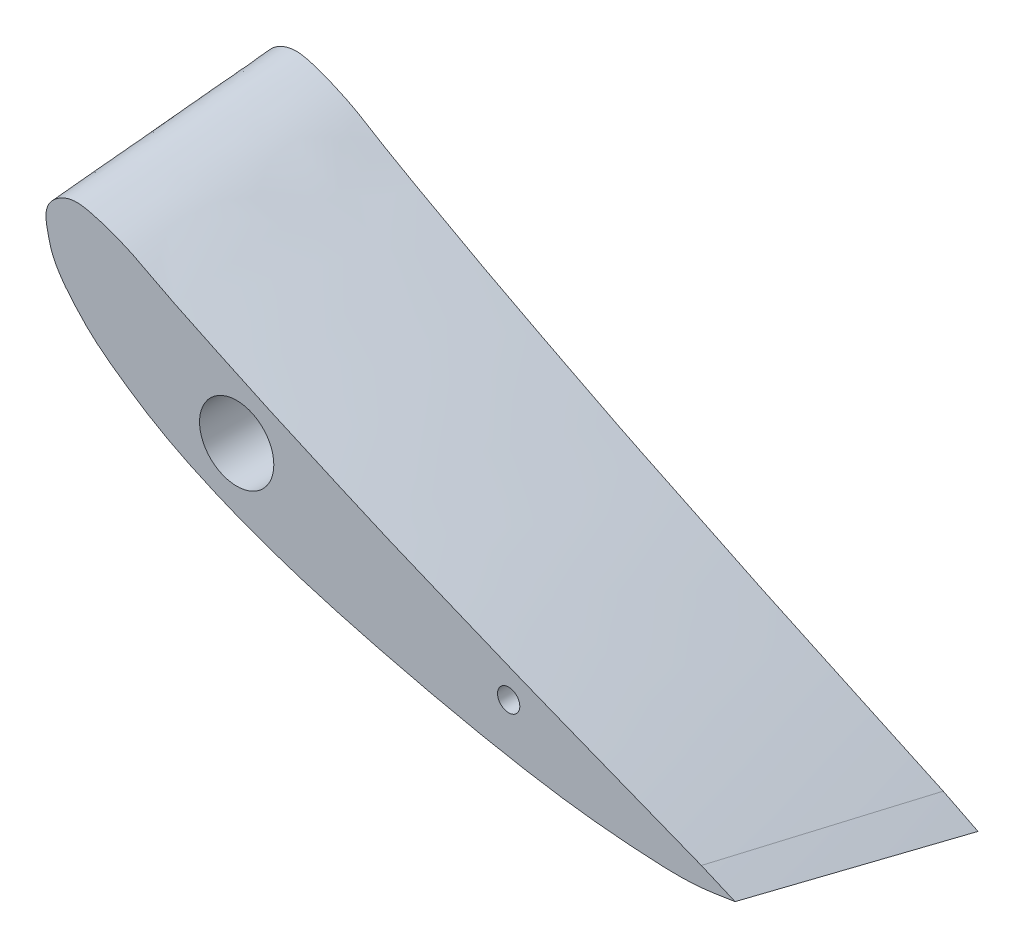
ISO-10303-21;
HEADER;
FILE_DESCRIPTION(('STEP AP214'),'2;1');
FILE_NAME('part.step','',(''),(''),'','','');
FILE_SCHEMA(('AUTOMOTIVE_DESIGN { 1 0 10303 214 1 1 1 1 }'));
ENDSEC;
DATA;
#1=APPLICATION_CONTEXT('core data for automotive mechanical design processes');
#2=APPLICATION_PROTOCOL_DEFINITION('international standard','automotive_design',2000,#1);
#3=PRODUCT_CONTEXT('',#1,'mechanical');
#4=PRODUCT('Part','Part','',(#3));
#5=PRODUCT_RELATED_PRODUCT_CATEGORY('part','',(#4));
#6=PRODUCT_DEFINITION_FORMATION('','',#4);
#7=PRODUCT_DEFINITION_CONTEXT('part definition',#1,'design');
#8=PRODUCT_DEFINITION('design','',#6,#7);
#9=PRODUCT_DEFINITION_SHAPE('','',#8);
#10=(LENGTH_UNIT() NAMED_UNIT(*) SI_UNIT(.MILLI.,.METRE.));
#11=(NAMED_UNIT(*) PLANE_ANGLE_UNIT() SI_UNIT($,.RADIAN.));
#12=(NAMED_UNIT(*) SI_UNIT($,.STERADIAN.) SOLID_ANGLE_UNIT());
#13=UNCERTAINTY_MEASURE_WITH_UNIT(LENGTH_MEASURE(1.E-05),#10,'distance_accuracy_value','');
#14=(GEOMETRIC_REPRESENTATION_CONTEXT(3) GLOBAL_UNCERTAINTY_ASSIGNED_CONTEXT((#13)) GLOBAL_UNIT_ASSIGNED_CONTEXT((#10,
#11,#12)) REPRESENTATION_CONTEXT('',''));
#15=CARTESIAN_POINT('',(0.,0.,0.));
#16=DIRECTION('',(0.,0.,1.));
#17=DIRECTION('',(1.,0.,0.));
#18=AXIS2_PLACEMENT_3D('',#15,#16,#17);
#19=CARTESIAN_POINT('',(-25.8751677995834,12.5690081194773,-30.));
#20=DIRECTION('',(0.,0.,1.));
#21=DIRECTION('',(1.,0.,0.));
#22=AXIS2_PLACEMENT_3D('',#19,#20,#21);
#23=PLANE('',#22);
#24=CARTESIAN_POINT('',(36.622171624693,-11.6170764544321,-30.));
#25=DIRECTION('',(0.,0.,1.));
#26=DIRECTION('',(1.,0.,0.));
#27=AXIS2_PLACEMENT_3D('',#24,#25,#26);
#28=CIRCLE('',#27,1.5);
#29=CARTESIAN_POINT('',(38.122171624693,-11.6170764544321,-30.));
#30=VERTEX_POINT('',#29);
#31=EDGE_CURVE('E86',#30,#30,#28,.T.);
#32=ORIENTED_EDGE('',*,*,#31,.T.);
#33=EDGE_LOOP('',(#32));
#34=FACE_BOUND('',#33,.T.);
#35=CARTESIAN_POINT('',(0.,0.,-30.));
#36=DIRECTION('',(0.,0.,1.));
#37=DIRECTION('',(1.,0.,0.));
#38=AXIS2_PLACEMENT_3D('',#35,#36,#37);
#39=CIRCLE('',#38,5.);
#40=CARTESIAN_POINT('',(5.,0.,-30.));
#41=VERTEX_POINT('',#40);
#42=EDGE_CURVE('E66',#41,#41,#39,.T.);
#43=ORIENTED_EDGE('',*,*,#42,.T.);
#44=EDGE_LOOP('',(#43));
#45=FACE_BOUND('',#44,.T.);
#46=CARTESIAN_POINT('',(65.134579844463,-22.9995309699649,-30.));
#47=CARTESIAN_POINT('',(63.5496914173049,-22.2622479812306,-30.));
#48=CARTESIAN_POINT('',(58.7950261358319,-20.0503990150295,-30.));
#49=CARTESIAN_POINT('',(50.8778175646714,-16.3487993381326,-30.));
#50=CARTESIAN_POINT('',(41.343512177954,-11.9802548823201,-30.));
#51=CARTESIAN_POINT('',(31.9375337278064,-7.34505211960584,-30.));
#52=CARTESIAN_POINT('',(22.4610505783409,-2.85785760789748,-30.));
#53=CARTESIAN_POINT('',(13.1446016186923,1.95170321629111,-30.));
#54=CARTESIAN_POINT('',(3.81950525001302,6.74877896799742,-30.));
#55=CARTESIAN_POINT('',(-3.8226140362771,10.9907198333955,-30.));
#56=CARTESIAN_POINT('',(-9.95617244202911,14.3624267984176,-30.));
#57=CARTESIAN_POINT('',(-13.6261568834983,16.7539862442742,-30.));
#58=CARTESIAN_POINT('',(-16.8002450756207,18.2635947971804,-30.));
#59=CARTESIAN_POINT('',(-19.2653703672842,19.2079849467583,-30.));
#60=CARTESIAN_POINT('',(-21.5497566138504,19.8875449709311,-30.));
#61=CARTESIAN_POINT('',(-24.1000289050709,19.4894676075075,-30.));
#62=CARTESIAN_POINT('',(-26.6314421320634,17.5564579994679,-30.));
#63=CARTESIAN_POINT('',(-26.2442569390299,14.4471042220962,-30.));
#64=CARTESIAN_POINT('',(-25.7490751742995,11.6691590226266,-30.));
#65=CARTESIAN_POINT('',(-24.4611817263747,9.14644262598379,-30.));
#66=CARTESIAN_POINT('',(-22.6381771557667,6.72250185075357,-30.));
#67=CARTESIAN_POINT('',(-20.2341111587322,3.84281458955476,-30.));
#68=CARTESIAN_POINT('',(-16.7499351377333,0.91480558609965,-30.));
#69=CARTESIAN_POINT('',(-11.1158272416026,-3.38409406051229,-30.));
#70=CARTESIAN_POINT('',(-3.42146655205404,-7.67973872015558,-30.));
#71=CARTESIAN_POINT('',(6.19304412057203,-11.958482747073,-30.));
#72=CARTESIAN_POINT('',(16.158449526063,-15.4745412344294,-30.));
#73=CARTESIAN_POINT('',(26.3070571919711,-18.6223597423882,-30.));
#74=CARTESIAN_POINT('',(36.6266930246887,-21.4801116507225,-30.));
#75=CARTESIAN_POINT('',(47.2043762073488,-23.9254585820161,-30.));
#76=CARTESIAN_POINT('',(56.2855215406593,-25.2414784154929,-30.));
#77=CARTESIAN_POINT('',(63.881322066473,-25.9531406334147,-30.));
#78=CARTESIAN_POINT('',(67.7951129091131,-25.557049069806,-30.));
#79=CARTESIAN_POINT('',(69.8184855595655,-25.3522755218309,-30.));
#80=B_SPLINE_CURVE_WITH_KNOTS('',3,(#46,#47,#48,#49,#50,#51,#52,#53,#54,#55,#56,#57,#58,#59,#60,
#61,#62,#63,#64,#65,#66,#67,#68,#69,#70,#71,#72,#73,#74,#75,#76,#77,#78,#79),.UNSPECIFIED.,.F.,
.F.,(4,1,1,1,1,1,1,1,1,1,1,1,1,1,1,1,1,1,1,1,1,1,1,1,1,1,1,1,1,1,1,4),(0.,0.024539223239315,
0.0736176697179449,0.122696116196575,0.171758102468826,0.220820088741077,0.269879113320182,
0.318936693489756,0.368025361597795,0.392583028094628,0.417173001250673,0.429440472758663,
0.441764658743505,0.454461371263475,0.461994015532278,0.477712656864197,0.492780517083889,
0.502278122505289,0.517831839222446,0.531656069899839,0.544957030128068,0.57036121074101,
0.595284183630096,0.644429948946362,0.693535769444944,0.742943262592495,0.792666042354747,
0.842690657547491,0.893260265870848,0.94491578158227,0.971522264346957,1.),.UNSPECIFIED.);
#81=CARTESIAN_POINT('',(65.134579844463,-22.9995309699649,-30.));
#82=VERTEX_POINT('',#81);
#83=CARTESIAN_POINT('',(69.8184855595655,-25.3522755218309,-30.));
#84=VERTEX_POINT('',#83);
#85=EDGE_CURVE('E63',#82,#84,#80,.T.);
#86=ORIENTED_EDGE('',*,*,#85,.F.);
#87=DIRECTION('',(-0.893602132590605,0.448859920943631,0.));
#88=VECTOR('',#87,1.);
#89=CARTESIAN_POINT('',(65.134579844463,-22.9995309699649,-30.));
#90=LINE('',#89,#88);
#91=EDGE_CURVE('E37',#84,#82,#90,.T.);
#92=ORIENTED_EDGE('',*,*,#91,.F.);
#93=EDGE_LOOP('',(#86,#92));
#94=FACE_BOUND('',#93,.T.);
#95=ADVANCED_FACE('F34',(#34,#45,#94),#23,.F.);
#96=CARTESIAN_POINT('',(-25.0498265206238,10.3590252410629,0.));
#97=DIRECTION('',(0.,0.,1.));
#98=DIRECTION('',(1.,0.,0.));
#99=AXIS2_PLACEMENT_3D('',#96,#97,#98);
#100=PLANE('',#99);
#101=CARTESIAN_POINT('',(36.622171624693,-11.6170764544321,0.));
#102=DIRECTION('',(0.,0.,1.));
#103=DIRECTION('',(1.,0.,0.));
#104=AXIS2_PLACEMENT_3D('',#101,#102,#103);
#105=CIRCLE('',#104,1.5);
#106=CARTESIAN_POINT('',(38.122171624693,-11.6170764544321,0.));
#107=VERTEX_POINT('',#106);
#108=EDGE_CURVE('E89',#107,#107,#105,.T.);
#109=ORIENTED_EDGE('',*,*,#108,.F.);
#110=EDGE_LOOP('',(#109));
#111=FACE_BOUND('',#110,.T.);
#112=CARTESIAN_POINT('',(0.,0.,0.));
#113=DIRECTION('',(0.,0.,1.));
#114=DIRECTION('',(1.,0.,0.));
#115=AXIS2_PLACEMENT_3D('',#112,#113,#114);
#116=CIRCLE('',#115,5.);
#117=CARTESIAN_POINT('',(5.,0.,0.));
#118=VERTEX_POINT('',#117);
#119=EDGE_CURVE('E80',#118,#118,#116,.T.);
#120=ORIENTED_EDGE('',*,*,#119,.F.);
#121=EDGE_LOOP('',(#120));
#122=FACE_BOUND('',#121,.T.);
#123=CARTESIAN_POINT('',(62.5682376225377,-17.9494229542019,0.));
#124=CARTESIAN_POINT('',(61.0357457282401,-17.3455695900279,0.));
#125=CARTESIAN_POINT('',(56.4382700453486,-15.5340094975074,0.));
#126=CARTESIAN_POINT('',(48.781755680583,-12.5000503526215,0.));
#127=CARTESIAN_POINT('',(39.5664322748496,-8.93022166843071,0.));
#128=CARTESIAN_POINT('',(30.4567321540915,-5.10230838615116,0.));
#129=CARTESIAN_POINT('',(21.2890860327248,-1.41760363622451,0.));
#130=CARTESIAN_POINT('',(12.2537365587949,2.57937965401302,0.));
#131=CARTESIAN_POINT('',(3.21095936745961,6.5641300105625,0.));
#132=CARTESIAN_POINT('',(-4.21736498331717,10.1219086891791,0.));
#133=CARTESIAN_POINT('',(-10.1774723136762,12.9464593951471,0.));
#134=CARTESIAN_POINT('',(-13.7648359699021,14.9884174682574,0.));
#135=CARTESIAN_POINT('',(-16.8358573857455,16.2288422339769,0.));
#136=CARTESIAN_POINT('',(-19.2080375673609,16.9777128391934,0.));
#137=CARTESIAN_POINT('',(-21.3952292871398,17.4877016099179,0.));
#138=CARTESIAN_POINT('',(-23.771560650514,16.9689972608538,0.));
#139=CARTESIAN_POINT('',(-26.0433252267511,15.0075642123905,0.));
#140=CARTESIAN_POINT('',(-25.5032404090968,12.1047307293946,0.));
#141=CARTESIAN_POINT('',(-24.8803183236597,9.51973752205132,0.));
#142=CARTESIAN_POINT('',(-23.5261895675087,7.21966070796016,0.));
#143=CARTESIAN_POINT('',(-21.6743094600578,5.04276467310707,0.));
#144=CARTESIAN_POINT('',(-19.2500879985792,2.47005140726315,0.));
#145=CARTESIAN_POINT('',(-15.8071546912047,-0.0870152275616799,0.));
#146=CARTESIAN_POINT('',(-10.2643938601049,-3.81195920309618,0.));
#147=CARTESIAN_POINT('',(-2.78389204739485,-7.41729783616147,0.));
#148=CARTESIAN_POINT('',(6.50179465100997,-10.898120976513,0.));
#149=CARTESIAN_POINT('',(16.0743983631768,-13.6416938121953,0.));
#150=CARTESIAN_POINT('',(25.798496222536,-16.0285276306475,0.));
#151=CARTESIAN_POINT('',(35.6670590562567,-18.1328429202074,0.));
#152=CARTESIAN_POINT('',(45.7550188838285,-19.8346426859498,0.));
#153=CARTESIAN_POINT('',(54.3714145651777,-20.558824847849,0.));
#154=CARTESIAN_POINT('',(61.5564708345186,-20.7985556166248,0.));
#155=CARTESIAN_POINT('',(65.2154740512997,-20.2045881455057,0.));
#156=CARTESIAN_POINT('',(67.1071252238897,-19.8975156460695,0.));
#157=B_SPLINE_CURVE_WITH_KNOTS('',3,(#123,#124,#125,#126,#127,#128,#129,#130,#131,#132,#133,
#134,#135,#136,#137,#138,#139,#140,#141,#142,#143,#144,#145,#146,#147,#148,#149,#150,#151,#152,
#153,#154,#155,#156),.UNSPECIFIED.,.F.,.F.,(4,1,1,1,1,1,1,1,1,1,1,1,1,1,1,1,1,1,1,1,1,1,1,1,1,1,
1,1,1,1,1,4),(0.,0.024539223239315,0.0736176697179449,0.122696116196575,0.171758102468826,
0.220820088741077,0.269879113320182,0.318936693489756,0.368025361597795,0.392583028094628,
0.417173001250673,0.429440472758663,0.441764658743505,0.454461371263475,0.461994015532278,
0.477712656864197,0.492780517083889,0.502278122505289,0.517831839222446,0.531656069899839,
0.544957030128068,0.57036121074101,0.595284183630096,0.644429948946362,0.693535769444944,
0.742943262592495,0.792666042354747,0.842690657547491,0.893260265870848,0.94491578158227,
0.971522264346957,1.),.UNSPECIFIED.);
#158=CARTESIAN_POINT('',(62.5682376225377,-17.9494229542019,0.));
#159=VERTEX_POINT('',#158);
#160=CARTESIAN_POINT('',(67.1071252238897,-19.8975156460695,0.));
#161=VERTEX_POINT('',#160);
#162=EDGE_CURVE('E43',#159,#161,#157,.T.);
#163=ORIENTED_EDGE('',*,*,#162,.T.);
#164=DIRECTION('',(-0.918935606831705,0.394407594370147,0.));
#165=VECTOR('',#164,1.);
#166=CARTESIAN_POINT('',(62.5682376225377,-17.9494229542019,0.));
#167=LINE('',#166,#165);
#168=EDGE_CURVE('E11',#161,#159,#167,.T.);
#169=ORIENTED_EDGE('',*,*,#168,.T.);
#170=EDGE_LOOP('',(#163,#169));
#171=FACE_BOUND('',#170,.T.);
#172=ADVANCED_FACE('F104',(#111,#122,#171),#100,.T.);
#173=CARTESIAN_POINT('',(67.1071252238897,-19.8975156460695,0.));
#174=CARTESIAN_POINT('',(69.8184855595655,-25.3522755218309,-30.));
#175=CARTESIAN_POINT('',(65.2154740512997,-20.2045881455057,0.));
#176=CARTESIAN_POINT('',(67.7951129091131,-25.557049069806,-30.));
#177=CARTESIAN_POINT('',(61.5564708345186,-20.7985556166248,0.));
#178=CARTESIAN_POINT('',(63.881322066473,-25.9531406334147,-30.));
#179=CARTESIAN_POINT('',(54.3714145651777,-20.558824847849,0.));
#180=CARTESIAN_POINT('',(56.2855215406593,-25.2414784154929,-30.));
#181=CARTESIAN_POINT('',(45.7550188838285,-19.8346426859498,0.));
#182=CARTESIAN_POINT('',(47.2043762073488,-23.9254585820161,-30.));
#183=CARTESIAN_POINT('',(35.6670590562567,-18.1328429202074,0.));
#184=CARTESIAN_POINT('',(36.6266930246887,-21.4801116507225,-30.));
#185=CARTESIAN_POINT('',(25.798496222536,-16.0285276306475,0.));
#186=CARTESIAN_POINT('',(26.3070571919711,-18.6223597423882,-30.));
#187=CARTESIAN_POINT('',(16.0743983631768,-13.6416938121953,0.));
#188=CARTESIAN_POINT('',(16.158449526063,-15.4745412344294,-30.));
#189=CARTESIAN_POINT('',(6.50179465100997,-10.898120976513,0.));
#190=CARTESIAN_POINT('',(6.19304412057203,-11.958482747073,-30.));
#191=CARTESIAN_POINT('',(-2.78389204739485,-7.41729783616147,0.));
#192=CARTESIAN_POINT('',(-3.42146655205404,-7.67973872015558,-30.));
#193=CARTESIAN_POINT('',(-10.2643938601049,-3.81195920309618,0.));
#194=CARTESIAN_POINT('',(-11.1158272416026,-3.38409406051229,-30.));
#195=CARTESIAN_POINT('',(-15.8071546912047,-0.0870152275616799,0.));
#196=CARTESIAN_POINT('',(-16.7499351377333,0.91480558609965,-30.));
#197=CARTESIAN_POINT('',(-19.2500879985792,2.47005140726315,0.));
#198=CARTESIAN_POINT('',(-20.2341111587322,3.84281458955476,-30.));
#199=CARTESIAN_POINT('',(-21.6743094600578,5.04276467310707,0.));
#200=CARTESIAN_POINT('',(-22.6381771557667,6.72250185075357,-30.));
#201=CARTESIAN_POINT('',(-23.5261895675087,7.21966070796016,0.));
#202=CARTESIAN_POINT('',(-24.4611817263747,9.14644262598379,-30.));
#203=CARTESIAN_POINT('',(-24.8803183236597,9.51973752205132,0.));
#204=CARTESIAN_POINT('',(-25.7490751742995,11.6691590226266,-30.));
#205=CARTESIAN_POINT('',(-25.5032404090968,12.1047307293946,0.));
#206=CARTESIAN_POINT('',(-26.2442569390299,14.4471042220962,-30.));
#207=CARTESIAN_POINT('',(-26.0433252267511,15.0075642123905,0.));
#208=CARTESIAN_POINT('',(-26.6314421320634,17.5564579994679,-30.));
#209=CARTESIAN_POINT('',(-23.771560650514,16.9689972608538,0.));
#210=CARTESIAN_POINT('',(-24.1000289050709,19.4894676075075,-30.));
#211=CARTESIAN_POINT('',(-21.3952292871398,17.4877016099179,0.));
#212=CARTESIAN_POINT('',(-21.5497566138504,19.8875449709311,-30.));
#213=CARTESIAN_POINT('',(-19.2080375673609,16.9777128391934,0.));
#214=CARTESIAN_POINT('',(-19.2653703672842,19.2079849467583,-30.));
#215=CARTESIAN_POINT('',(-16.8358573857455,16.2288422339769,0.));
#216=CARTESIAN_POINT('',(-16.8002450756207,18.2635947971804,-30.));
#217=CARTESIAN_POINT('',(-13.7648359699021,14.9884174682574,0.));
#218=CARTESIAN_POINT('',(-13.6261568834983,16.7539862442742,-30.));
#219=CARTESIAN_POINT('',(-10.1774723136762,12.9464593951471,0.));
#220=CARTESIAN_POINT('',(-9.95617244202911,14.3624267984176,-30.));
#221=CARTESIAN_POINT('',(-4.21736498331717,10.1219086891791,0.));
#222=CARTESIAN_POINT('',(-3.8226140362771,10.9907198333955,-30.));
#223=CARTESIAN_POINT('',(3.21095936745961,6.5641300105625,0.));
#224=CARTESIAN_POINT('',(3.81950525001302,6.74877896799742,-30.));
#225=CARTESIAN_POINT('',(12.2537365587949,2.57937965401302,0.));
#226=CARTESIAN_POINT('',(13.1446016186923,1.95170321629111,-30.));
#227=CARTESIAN_POINT('',(21.2890860327248,-1.41760363622451,0.));
#228=CARTESIAN_POINT('',(22.4610505783409,-2.85785760789748,-30.));
#229=CARTESIAN_POINT('',(30.4567321540915,-5.10230838615116,0.));
#230=CARTESIAN_POINT('',(31.9375337278064,-7.34505211960584,-30.));
#231=CARTESIAN_POINT('',(39.5664322748496,-8.93022166843071,0.));
#232=CARTESIAN_POINT('',(41.343512177954,-11.9802548823201,-30.));
#233=CARTESIAN_POINT('',(48.781755680583,-12.5000503526215,0.));
#234=CARTESIAN_POINT('',(50.8778175646714,-16.3487993381326,-30.));
#235=CARTESIAN_POINT('',(56.4382700453486,-15.5340094975074,0.));
#236=CARTESIAN_POINT('',(58.7950261358319,-20.0503990150295,-30.));
#237=CARTESIAN_POINT('',(61.0357457282401,-17.3455695900279,0.));
#238=CARTESIAN_POINT('',(63.5496914173049,-22.2622479812306,-30.));
#239=CARTESIAN_POINT('',(62.5682376225377,-17.9494229542019,0.));
#240=CARTESIAN_POINT('',(65.134579844463,-22.9995309699649,-30.));
#241=B_SPLINE_SURFACE_WITH_KNOTS('',3,1,((#173,#174),(#175,#176),(#177,#178),(#179,#180),(#181,
#182),(#183,#184),(#185,#186),(#187,#188),(#189,#190),(#191,#192),(#193,#194),(#195,#196),(#197,
#198),(#199,#200),(#201,#202),(#203,#204),(#205,#206),(#207,#208),(#209,#210),(#211,#212),(#213,
#214),(#215,#216),(#217,#218),(#219,#220),(#221,#222),(#223,#224),(#225,#226),(#227,#228),(#229,
#230),(#231,#232),(#233,#234),(#235,#236),(#237,#238),(#239,#240)),.UNSPECIFIED.,.F.,.F.,.F.,(4,
1,1,1,1,1,1,1,1,1,1,1,1,1,1,1,1,1,1,1,1,1,1,1,1,1,1,1,1,1,1,4),(2,2),(0.,0.0284777356530428,
0.05508421841773,0.106739734129152,0.157309342452509,0.207333957645253,0.257056737407505,
0.306464230555056,0.355570051053638,0.404715816369904,0.42963878925899,0.455042969871932,
0.468343930100161,0.482168160777554,0.497721877494711,0.507219482916111,0.522287343135803,
0.538005984467722,0.545538628736525,0.558235341256495,0.570559527241337,0.582826998749327,
0.607416971905372,0.631974638402205,0.681063306510244,0.730120886679818,0.779179911258923,
0.828241897531174,0.877303883803425,0.926382330282055,0.975460776760685,1.),(0.,1.),.UNSPECIFIED.);
#242=DIRECTION('',(0.0840592893102955,-0.165413827944896,-0.982635385789289));
#243=VECTOR('',#242,1.);
#244=CARTESIAN_POINT('',(63.8514087335004,-20.4744769620834,-15.));
#245=LINE('',#244,#243);
#246=EDGE_CURVE('E58',#159,#82,#245,.T.);
#247=DIRECTION('',(-0.0885712771449092,0.178189170343001,0.980001912466191));
#248=VECTOR('',#247,1.);
#249=CARTESIAN_POINT('',(68.4628053917276,-22.6248955839502,-15.));
#250=LINE('',#249,#248);
#251=EDGE_CURVE('E52',#84,#161,#250,.T.);
#252=ORIENTED_EDGE('',*,*,#162,.F.);
#253=ORIENTED_EDGE('',*,*,#246,.T.);
#254=ORIENTED_EDGE('',*,*,#85,.T.);
#255=ORIENTED_EDGE('',*,*,#251,.T.);
#256=EDGE_LOOP('',(#252,#253,#254,#255));
#257=FACE_BOUND('',#256,.T.);
#258=ADVANCED_FACE('F65',(#257),#241,.T.);
#259=CARTESIAN_POINT('',(62.5682376225377,-17.9494229542019,0.));
#260=CARTESIAN_POINT('',(65.134579844463,-22.9995309699649,-30.));
#261=CARTESIAN_POINT('',(63.3247188894297,-18.2741050695132,0.));
#262=CARTESIAN_POINT('',(65.9152307969801,-23.3916550619426,-30.));
#263=CARTESIAN_POINT('',(64.0812001563217,-18.5987871848244,0.));
#264=CARTESIAN_POINT('',(66.6958817494971,-23.7837791539202,-30.));
#265=CARTESIAN_POINT('',(65.5941626901057,-19.2481514154469,0.));
#266=CARTESIAN_POINT('',(68.2571836545313,-24.5680273378755,-30.));
#267=CARTESIAN_POINT('',(66.3506439569977,-19.5728335307582,0.));
#268=CARTESIAN_POINT('',(69.0378346070484,-24.9601514298532,-30.));
#269=CARTESIAN_POINT('',(67.1071252238897,-19.8975156460695,0.));
#270=CARTESIAN_POINT('',(69.8184855595655,-25.3522755218309,-30.));
#271=B_SPLINE_SURFACE_WITH_KNOTS('',3,1,((#259,#260),(#261,#262),(#263,#264),(#265,#266),(#267,
#268),(#269,#270)),.UNSPECIFIED.,.F.,.F.,.F.,(4,2,4),(2,2),(0.,0.5,1.),(0.,1.),.UNSPECIFIED.);
#272=ORIENTED_EDGE('',*,*,#168,.F.);
#273=ORIENTED_EDGE('',*,*,#251,.F.);
#274=ORIENTED_EDGE('',*,*,#91,.T.);
#275=ORIENTED_EDGE('',*,*,#246,.F.);
#276=EDGE_LOOP('',(#272,#273,#274,#275));
#277=FACE_BOUND('',#276,.T.);
#278=ADVANCED_FACE('F67',(#277),#271,.T.);
#279=CARTESIAN_POINT('',(0.,0.,-30.));
#280=DIRECTION('',(0.,0.,1.));
#281=DIRECTION('',(1.,0.,0.));
#282=AXIS2_PLACEMENT_3D('',#279,#280,#281);
#283=CYLINDRICAL_SURFACE('',#282,5.);
#284=ORIENTED_EDGE('',*,*,#42,.F.);
#285=EDGE_LOOP('',(#284));
#286=FACE_BOUND('',#285,.T.);
#287=ORIENTED_EDGE('',*,*,#119,.T.);
#288=EDGE_LOOP('',(#287));
#289=FACE_BOUND('',#288,.T.);
#290=ADVANCED_FACE('F100',(#286,#289),#283,.F.);
#291=CARTESIAN_POINT('',(36.622171624693,-11.6170764544321,-30.));
#292=DIRECTION('',(0.,0.,1.));
#293=DIRECTION('',(1.,0.,0.));
#294=AXIS2_PLACEMENT_3D('',#291,#292,#293);
#295=CYLINDRICAL_SURFACE('',#294,1.5);
#296=ORIENTED_EDGE('',*,*,#31,.F.);
#297=EDGE_LOOP('',(#296));
#298=FACE_BOUND('',#297,.T.);
#299=ORIENTED_EDGE('',*,*,#108,.T.);
#300=EDGE_LOOP('',(#299));
#301=FACE_BOUND('',#300,.T.);
#302=ADVANCED_FACE('F97',(#298,#301),#295,.F.);
#303=CLOSED_SHELL('',(#95,#172,#258,#278,#290,#302));
#304=MANIFOLD_SOLID_BREP('B2',#303);
#305=ADVANCED_BREP_SHAPE_REPRESENTATION('',(#18,#304),#14);
#306=SHAPE_DEFINITION_REPRESENTATION(#9,#305);
ENDSEC;
END-ISO-10303-21;
